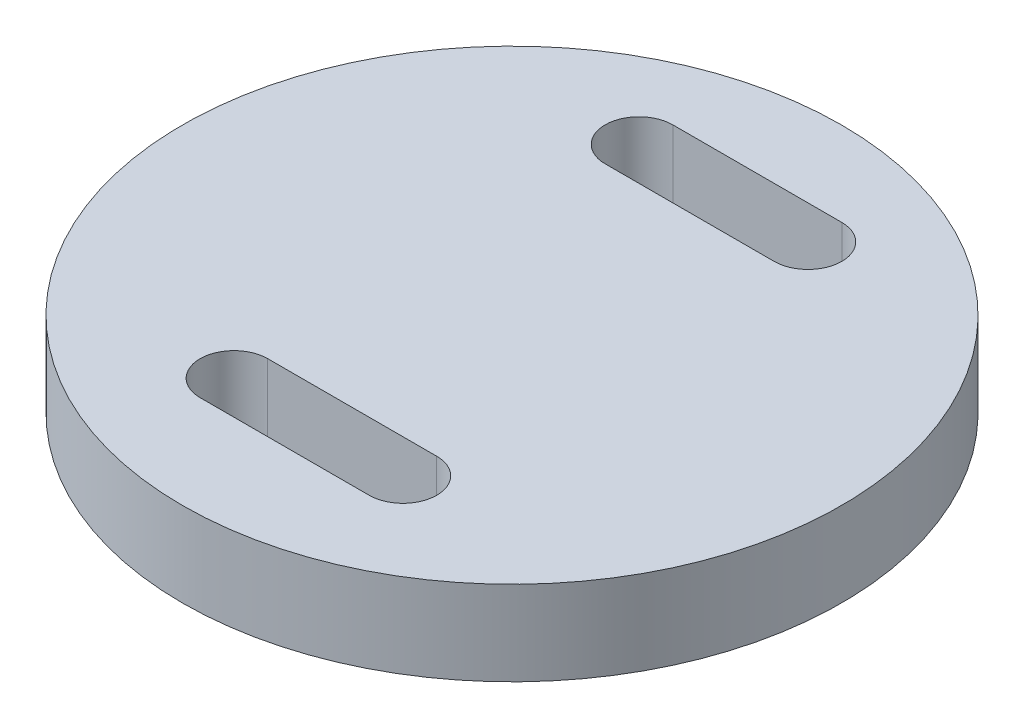
ISO-10303-21;
HEADER;
FILE_DESCRIPTION(('STEP AP214'),'2;1');
FILE_NAME('part.step','',(''),(''),'','','');
FILE_SCHEMA(('AUTOMOTIVE_DESIGN { 1 0 10303 214 1 1 1 1 }'));
ENDSEC;
DATA;
#1=APPLICATION_CONTEXT('core data for automotive mechanical design processes');
#2=APPLICATION_PROTOCOL_DEFINITION('international standard','automotive_design',2000,#1);
#3=PRODUCT_CONTEXT('',#1,'mechanical');
#4=PRODUCT('Part','Part','',(#3));
#5=PRODUCT_RELATED_PRODUCT_CATEGORY('part','',(#4));
#6=PRODUCT_DEFINITION_FORMATION('','',#4);
#7=PRODUCT_DEFINITION_CONTEXT('part definition',#1,'design');
#8=PRODUCT_DEFINITION('design','',#6,#7);
#9=PRODUCT_DEFINITION_SHAPE('','',#8);
#10=(LENGTH_UNIT() NAMED_UNIT(*) SI_UNIT(.MILLI.,.METRE.));
#11=(NAMED_UNIT(*) PLANE_ANGLE_UNIT() SI_UNIT($,.RADIAN.));
#12=(NAMED_UNIT(*) SI_UNIT($,.STERADIAN.) SOLID_ANGLE_UNIT());
#13=UNCERTAINTY_MEASURE_WITH_UNIT(LENGTH_MEASURE(1.E-05),#10,'distance_accuracy_value','');
#14=(GEOMETRIC_REPRESENTATION_CONTEXT(3) GLOBAL_UNCERTAINTY_ASSIGNED_CONTEXT((#13)) GLOBAL_UNIT_ASSIGNED_CONTEXT((#10,
#11,#12)) REPRESENTATION_CONTEXT('',''));
#15=CARTESIAN_POINT('',(0.,0.,0.));
#16=DIRECTION('',(0.,0.,1.));
#17=DIRECTION('',(1.,0.,0.));
#18=AXIS2_PLACEMENT_3D('',#15,#16,#17);
#19=CARTESIAN_POINT('',(0.,12.7,0.));
#20=DIRECTION('',(0.,-1.,0.));
#21=DIRECTION('',(0.,0.,-1.));
#22=AXIS2_PLACEMENT_3D('',#19,#20,#21);
#23=CYLINDRICAL_SURFACE('',#22,49.53);
#24=CARTESIAN_POINT('',(0.,12.7,0.));
#25=DIRECTION('',(0.,1.,0.));
#26=DIRECTION('',(0.,0.,1.));
#27=AXIS2_PLACEMENT_3D('',#24,#25,#26);
#28=CIRCLE('',#27,49.53);
#29=CARTESIAN_POINT('',(0.,12.7,49.53));
#30=VERTEX_POINT('',#29);
#31=EDGE_CURVE('E11',#30,#30,#28,.T.);
#32=ORIENTED_EDGE('',*,*,#31,.F.);
#33=EDGE_LOOP('',(#32));
#34=FACE_BOUND('',#33,.T.);
#35=CARTESIAN_POINT('',(0.,0.,0.));
#36=DIRECTION('',(0.,1.,0.));
#37=DIRECTION('',(0.,0.,1.));
#38=AXIS2_PLACEMENT_3D('',#35,#36,#37);
#39=CIRCLE('',#38,49.53);
#40=CARTESIAN_POINT('',(0.,0.,49.53));
#41=VERTEX_POINT('',#40);
#42=EDGE_CURVE('E42',#41,#41,#39,.T.);
#43=ORIENTED_EDGE('',*,*,#42,.T.);
#44=EDGE_LOOP('',(#43));
#45=FACE_BOUND('',#44,.T.);
#46=ADVANCED_FACE('F39',(#34,#45),#23,.T.);
#47=CARTESIAN_POINT('',(0.,12.7,0.));
#48=DIRECTION('',(0.,1.,0.));
#49=DIRECTION('',(0.,0.,1.));
#50=AXIS2_PLACEMENT_3D('',#47,#48,#49);
#51=PLANE('',#50);
#52=CARTESIAN_POINT('',(12.7,12.7,29.0899412810257));
#53=DIRECTION('',(0.,1.,0.));
#54=DIRECTION('',(0.,0.,1.));
#55=AXIS2_PLACEMENT_3D('',#52,#53,#54);
#56=CIRCLE('',#55,5.08);
#57=CARTESIAN_POINT('',(12.7,12.7,34.1699412810257));
#58=VERTEX_POINT('',#57);
#59=CARTESIAN_POINT('',(12.7,12.7,24.0099412810257));
#60=VERTEX_POINT('',#59);
#61=EDGE_CURVE('E54',#58,#60,#56,.T.);
#62=ORIENTED_EDGE('',*,*,#61,.F.);
#63=DIRECTION('',(1.,0.,0.));
#64=VECTOR('',#63,1.);
#65=CARTESIAN_POINT('',(12.7,12.7,34.1699412810257));
#66=LINE('',#65,#64);
#67=CARTESIAN_POINT('',(-12.7,12.7,34.1699412810257));
#68=VERTEX_POINT('',#67);
#69=EDGE_CURVE('E128',#68,#58,#66,.T.);
#70=ORIENTED_EDGE('',*,*,#69,.F.);
#71=CARTESIAN_POINT('',(-12.7,12.7,29.0899412810257));
#72=DIRECTION('',(0.,1.,0.));
#73=DIRECTION('',(0.,0.,1.));
#74=AXIS2_PLACEMENT_3D('',#71,#72,#73);
#75=CIRCLE('',#74,5.08);
#76=CARTESIAN_POINT('',(-12.7,12.7,24.0099412810257));
#77=VERTEX_POINT('',#76);
#78=EDGE_CURVE('E132',#77,#68,#75,.T.);
#79=ORIENTED_EDGE('',*,*,#78,.F.);
#80=DIRECTION('',(-1.,0.,0.));
#81=VECTOR('',#80,1.);
#82=CARTESIAN_POINT('',(12.7,12.7,24.0099412810257));
#83=LINE('',#82,#81);
#84=EDGE_CURVE('E141',#60,#77,#83,.T.);
#85=ORIENTED_EDGE('',*,*,#84,.F.);
#86=EDGE_LOOP('',(#62,#70,#79,#85));
#87=FACE_BOUND('',#86,.T.);
#88=CARTESIAN_POINT('',(-12.7,12.7,-31.7840359834671));
#89=DIRECTION('',(0.,1.,0.));
#90=DIRECTION('',(0.,0.,1.));
#91=AXIS2_PLACEMENT_3D('',#88,#89,#90);
#92=CIRCLE('',#91,5.08);
#93=CARTESIAN_POINT('',(-12.7,12.7,-36.8640359834671));
#94=VERTEX_POINT('',#93);
#95=CARTESIAN_POINT('',(-12.7,12.7,-26.7040359834671));
#96=VERTEX_POINT('',#95);
#97=EDGE_CURVE('E62',#94,#96,#92,.T.);
#98=ORIENTED_EDGE('',*,*,#97,.F.);
#99=DIRECTION('',(-1.,0.,0.));
#100=VECTOR('',#99,1.);
#101=CARTESIAN_POINT('',(-12.7,12.7,-36.8640359834671));
#102=LINE('',#101,#100);
#103=CARTESIAN_POINT('',(12.7,12.7,-36.8640359834671));
#104=VERTEX_POINT('',#103);
#105=EDGE_CURVE('E161',#104,#94,#102,.T.);
#106=ORIENTED_EDGE('',*,*,#105,.F.);
#107=CARTESIAN_POINT('',(12.7,12.7,-31.7840359834671));
#108=DIRECTION('',(0.,1.,0.));
#109=DIRECTION('',(0.,0.,1.));
#110=AXIS2_PLACEMENT_3D('',#107,#108,#109);
#111=CIRCLE('',#110,5.08);
#112=CARTESIAN_POINT('',(12.7,12.7,-26.7040359834671));
#113=VERTEX_POINT('',#112);
#114=EDGE_CURVE('E180',#113,#104,#111,.T.);
#115=ORIENTED_EDGE('',*,*,#114,.F.);
#116=DIRECTION('',(1.,0.,0.));
#117=VECTOR('',#116,1.);
#118=CARTESIAN_POINT('',(-12.7,12.7,-26.7040359834671));
#119=LINE('',#118,#117);
#120=EDGE_CURVE('E176',#96,#113,#119,.T.);
#121=ORIENTED_EDGE('',*,*,#120,.F.);
#122=EDGE_LOOP('',(#98,#106,#115,#121));
#123=FACE_BOUND('',#122,.T.);
#124=ORIENTED_EDGE('',*,*,#31,.T.);
#125=EDGE_LOOP('',(#124));
#126=FACE_BOUND('',#125,.T.);
#127=ADVANCED_FACE('F204',(#87,#123,#126),#51,.T.);
#128=CARTESIAN_POINT('',(0.,0.,0.));
#129=DIRECTION('',(0.,1.,0.));
#130=DIRECTION('',(0.,0.,1.));
#131=AXIS2_PLACEMENT_3D('',#128,#129,#130);
#132=PLANE('',#131);
#133=DIRECTION('',(1.,0.,0.));
#134=VECTOR('',#133,1.);
#135=CARTESIAN_POINT('',(12.7,0.,34.1699412810257));
#136=LINE('',#135,#134);
#137=CARTESIAN_POINT('',(-12.7,0.,34.1699412810257));
#138=VERTEX_POINT('',#137);
#139=CARTESIAN_POINT('',(12.7,0.,34.1699412810257));
#140=VERTEX_POINT('',#139);
#141=EDGE_CURVE('E113',#138,#140,#136,.T.);
#142=ORIENTED_EDGE('',*,*,#141,.T.);
#143=CARTESIAN_POINT('',(12.7,0.,29.0899412810257));
#144=DIRECTION('',(0.,1.,0.));
#145=DIRECTION('',(0.,0.,1.));
#146=AXIS2_PLACEMENT_3D('',#143,#144,#145);
#147=CIRCLE('',#146,5.08);
#148=CARTESIAN_POINT('',(12.7,0.,24.0099412810257));
#149=VERTEX_POINT('',#148);
#150=EDGE_CURVE('E106',#140,#149,#147,.T.);
#151=ORIENTED_EDGE('',*,*,#150,.T.);
#152=DIRECTION('',(-1.,0.,0.));
#153=VECTOR('',#152,1.);
#154=CARTESIAN_POINT('',(12.7,0.,24.0099412810257));
#155=LINE('',#154,#153);
#156=CARTESIAN_POINT('',(-12.7,0.,24.0099412810257));
#157=VERTEX_POINT('',#156);
#158=EDGE_CURVE('E117',#149,#157,#155,.T.);
#159=ORIENTED_EDGE('',*,*,#158,.T.);
#160=CARTESIAN_POINT('',(-12.7,0.,29.0899412810257));
#161=DIRECTION('',(0.,1.,0.));
#162=DIRECTION('',(0.,0.,1.));
#163=AXIS2_PLACEMENT_3D('',#160,#161,#162);
#164=CIRCLE('',#163,5.08);
#165=EDGE_CURVE('E122',#157,#138,#164,.T.);
#166=ORIENTED_EDGE('',*,*,#165,.T.);
#167=EDGE_LOOP('',(#142,#151,#159,#166));
#168=FACE_BOUND('',#167,.T.);
#169=DIRECTION('',(-1.,0.,0.));
#170=VECTOR('',#169,1.);
#171=CARTESIAN_POINT('',(-12.7,0.,-36.8640359834671));
#172=LINE('',#171,#170);
#173=CARTESIAN_POINT('',(12.7,0.,-36.8640359834671));
#174=VERTEX_POINT('',#173);
#175=CARTESIAN_POINT('',(-12.7,0.,-36.8640359834671));
#176=VERTEX_POINT('',#175);
#177=EDGE_CURVE('E169',#174,#176,#172,.T.);
#178=ORIENTED_EDGE('',*,*,#177,.T.);
#179=CARTESIAN_POINT('',(-12.7,0.,-31.7840359834671));
#180=DIRECTION('',(0.,1.,0.));
#181=DIRECTION('',(0.,0.,1.));
#182=AXIS2_PLACEMENT_3D('',#179,#180,#181);
#183=CIRCLE('',#182,5.08);
#184=CARTESIAN_POINT('',(-12.7,0.,-26.7040359834671));
#185=VERTEX_POINT('',#184);
#186=EDGE_CURVE('E156',#176,#185,#183,.T.);
#187=ORIENTED_EDGE('',*,*,#186,.T.);
#188=DIRECTION('',(1.,0.,0.));
#189=VECTOR('',#188,1.);
#190=CARTESIAN_POINT('',(-12.7,0.,-26.7040359834671));
#191=LINE('',#190,#189);
#192=CARTESIAN_POINT('',(12.7,0.,-26.7040359834671));
#193=VERTEX_POINT('',#192);
#194=EDGE_CURVE('E160',#185,#193,#191,.T.);
#195=ORIENTED_EDGE('',*,*,#194,.T.);
#196=CARTESIAN_POINT('',(12.7,0.,-31.7840359834671));
#197=DIRECTION('',(0.,1.,0.));
#198=DIRECTION('',(0.,0.,1.));
#199=AXIS2_PLACEMENT_3D('',#196,#197,#198);
#200=CIRCLE('',#199,5.08);
#201=EDGE_CURVE('E165',#193,#174,#200,.T.);
#202=ORIENTED_EDGE('',*,*,#201,.T.);
#203=EDGE_LOOP('',(#178,#187,#195,#202));
#204=FACE_BOUND('',#203,.T.);
#205=ORIENTED_EDGE('',*,*,#42,.F.);
#206=EDGE_LOOP('',(#205));
#207=FACE_BOUND('',#206,.T.);
#208=ADVANCED_FACE('F124',(#168,#204,#207),#132,.F.);
#209=CARTESIAN_POINT('',(-12.7,0.,-31.7840359834671));
#210=DIRECTION('',(0.,1.,0.));
#211=DIRECTION('',(0.,0.,1.));
#212=AXIS2_PLACEMENT_3D('',#209,#210,#211);
#213=CYLINDRICAL_SURFACE('',#212,5.08);
#214=ORIENTED_EDGE('',*,*,#97,.T.);
#215=DIRECTION('',(0.,1.,0.));
#216=VECTOR('',#215,1.);
#217=CARTESIAN_POINT('',(-12.7,0.,-26.7040359834671));
#218=LINE('',#217,#216);
#219=EDGE_CURVE('E173',#185,#96,#218,.T.);
#220=ORIENTED_EDGE('',*,*,#219,.F.);
#221=ORIENTED_EDGE('',*,*,#186,.F.);
#222=DIRECTION('',(0.,1.,0.));
#223=VECTOR('',#222,1.);
#224=CARTESIAN_POINT('',(-12.7,0.,-36.8640359834671));
#225=LINE('',#224,#223);
#226=EDGE_CURVE('E142',#176,#94,#225,.T.);
#227=ORIENTED_EDGE('',*,*,#226,.T.);
#228=EDGE_LOOP('',(#214,#220,#221,#227));
#229=FACE_BOUND('',#228,.T.);
#230=ADVANCED_FACE('F211',(#229),#213,.F.);
#231=CARTESIAN_POINT('',(-12.7,0.,-36.8640359834671));
#232=DIRECTION('',(0.,0.,-1.));
#233=DIRECTION('',(-1.,0.,0.));
#234=AXIS2_PLACEMENT_3D('',#231,#232,#233);
#235=PLANE('',#234);
#236=ORIENTED_EDGE('',*,*,#105,.T.);
#237=ORIENTED_EDGE('',*,*,#226,.F.);
#238=ORIENTED_EDGE('',*,*,#177,.F.);
#239=DIRECTION('',(0.,1.,0.));
#240=VECTOR('',#239,1.);
#241=CARTESIAN_POINT('',(12.7,0.,-36.8640359834671));
#242=LINE('',#241,#240);
#243=EDGE_CURVE('E189',#174,#104,#242,.T.);
#244=ORIENTED_EDGE('',*,*,#243,.T.);
#245=EDGE_LOOP('',(#236,#237,#238,#244));
#246=FACE_BOUND('',#245,.T.);
#247=ADVANCED_FACE('F213',(#246),#235,.F.);
#248=CARTESIAN_POINT('',(12.7,0.,-31.7840359834671));
#249=DIRECTION('',(0.,1.,0.));
#250=DIRECTION('',(0.,0.,1.));
#251=AXIS2_PLACEMENT_3D('',#248,#249,#250);
#252=CYLINDRICAL_SURFACE('',#251,5.08);
#253=ORIENTED_EDGE('',*,*,#114,.T.);
#254=ORIENTED_EDGE('',*,*,#243,.F.);
#255=ORIENTED_EDGE('',*,*,#201,.F.);
#256=DIRECTION('',(0.,1.,0.));
#257=VECTOR('',#256,1.);
#258=CARTESIAN_POINT('',(12.7,0.,-26.7040359834671));
#259=LINE('',#258,#257);
#260=EDGE_CURVE('E192',#193,#113,#259,.T.);
#261=ORIENTED_EDGE('',*,*,#260,.T.);
#262=EDGE_LOOP('',(#253,#254,#255,#261));
#263=FACE_BOUND('',#262,.T.);
#264=ADVANCED_FACE('F208',(#263),#252,.F.);
#265=CARTESIAN_POINT('',(-12.7,0.,-26.7040359834671));
#266=DIRECTION('',(0.,0.,1.));
#267=DIRECTION('',(1.,0.,0.));
#268=AXIS2_PLACEMENT_3D('',#265,#266,#267);
#269=PLANE('',#268);
#270=ORIENTED_EDGE('',*,*,#120,.T.);
#271=ORIENTED_EDGE('',*,*,#260,.F.);
#272=ORIENTED_EDGE('',*,*,#194,.F.);
#273=ORIENTED_EDGE('',*,*,#219,.T.);
#274=EDGE_LOOP('',(#270,#271,#272,#273));
#275=FACE_BOUND('',#274,.T.);
#276=ADVANCED_FACE('F199',(#275),#269,.F.);
#277=CARTESIAN_POINT('',(12.7,0.,29.0899412810257));
#278=DIRECTION('',(0.,1.,0.));
#279=DIRECTION('',(0.,0.,1.));
#280=AXIS2_PLACEMENT_3D('',#277,#278,#279);
#281=CYLINDRICAL_SURFACE('',#280,5.08);
#282=ORIENTED_EDGE('',*,*,#61,.T.);
#283=DIRECTION('',(0.,1.,0.));
#284=VECTOR('',#283,1.);
#285=CARTESIAN_POINT('',(12.7,0.,24.0099412810257));
#286=LINE('',#285,#284);
#287=EDGE_CURVE('E102',#149,#60,#286,.T.);
#288=ORIENTED_EDGE('',*,*,#287,.F.);
#289=ORIENTED_EDGE('',*,*,#150,.F.);
#290=DIRECTION('',(0.,1.,0.));
#291=VECTOR('',#290,1.);
#292=CARTESIAN_POINT('',(12.7,0.,34.1699412810257));
#293=LINE('',#292,#291);
#294=EDGE_CURVE('E148',#140,#58,#293,.T.);
#295=ORIENTED_EDGE('',*,*,#294,.T.);
#296=EDGE_LOOP('',(#282,#288,#289,#295));
#297=FACE_BOUND('',#296,.T.);
#298=ADVANCED_FACE('F104',(#297),#281,.F.);
#299=CARTESIAN_POINT('',(12.7,0.,34.1699412810257));
#300=DIRECTION('',(0.,0.,1.));
#301=DIRECTION('',(1.,0.,0.));
#302=AXIS2_PLACEMENT_3D('',#299,#300,#301);
#303=PLANE('',#302);
#304=ORIENTED_EDGE('',*,*,#69,.T.);
#305=ORIENTED_EDGE('',*,*,#294,.F.);
#306=ORIENTED_EDGE('',*,*,#141,.F.);
#307=DIRECTION('',(0.,1.,0.));
#308=VECTOR('',#307,1.);
#309=CARTESIAN_POINT('',(-12.7,0.,34.1699412810257));
#310=LINE('',#309,#308);
#311=EDGE_CURVE('E151',#138,#68,#310,.T.);
#312=ORIENTED_EDGE('',*,*,#311,.T.);
#313=EDGE_LOOP('',(#304,#305,#306,#312));
#314=FACE_BOUND('',#313,.T.);
#315=ADVANCED_FACE('F243',(#314),#303,.F.);
#316=CARTESIAN_POINT('',(-12.7,0.,29.0899412810257));
#317=DIRECTION('',(0.,1.,0.));
#318=DIRECTION('',(0.,0.,1.));
#319=AXIS2_PLACEMENT_3D('',#316,#317,#318);
#320=CYLINDRICAL_SURFACE('',#319,5.08);
#321=ORIENTED_EDGE('',*,*,#78,.T.);
#322=ORIENTED_EDGE('',*,*,#311,.F.);
#323=ORIENTED_EDGE('',*,*,#165,.F.);
#324=DIRECTION('',(0.,1.,0.));
#325=VECTOR('',#324,1.);
#326=CARTESIAN_POINT('',(-12.7,0.,24.0099412810257));
#327=LINE('',#326,#325);
#328=EDGE_CURVE('E112',#157,#77,#327,.T.);
#329=ORIENTED_EDGE('',*,*,#328,.T.);
#330=EDGE_LOOP('',(#321,#322,#323,#329));
#331=FACE_BOUND('',#330,.T.);
#332=ADVANCED_FACE('F247',(#331),#320,.F.);
#333=CARTESIAN_POINT('',(12.7,0.,24.0099412810257));
#334=DIRECTION('',(0.,0.,-1.));
#335=DIRECTION('',(-1.,0.,0.));
#336=AXIS2_PLACEMENT_3D('',#333,#334,#335);
#337=PLANE('',#336);
#338=ORIENTED_EDGE('',*,*,#84,.T.);
#339=ORIENTED_EDGE('',*,*,#328,.F.);
#340=ORIENTED_EDGE('',*,*,#158,.F.);
#341=ORIENTED_EDGE('',*,*,#287,.T.);
#342=EDGE_LOOP('',(#338,#339,#340,#341));
#343=FACE_BOUND('',#342,.T.);
#344=ADVANCED_FACE('F118',(#343),#337,.F.);
#345=CLOSED_SHELL('',(#46,#127,#208,#230,#247,#264,#276,#298,#315,#332,#344));
#346=MANIFOLD_SOLID_BREP('B2',#345);
#347=ADVANCED_BREP_SHAPE_REPRESENTATION('',(#18,#346),#14);
#348=SHAPE_DEFINITION_REPRESENTATION(#9,#347);
ENDSEC;
END-ISO-10303-21;
